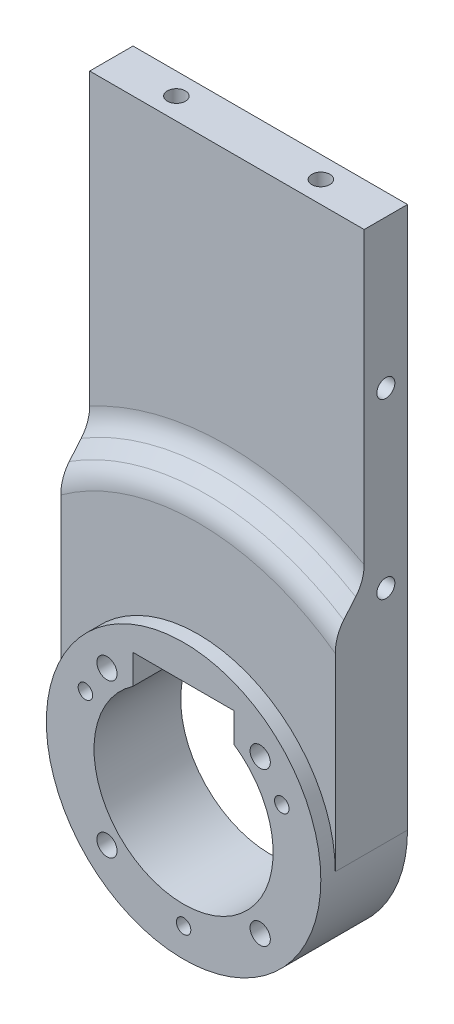
ISO-10303-21;
HEADER;
FILE_DESCRIPTION(('STEP AP214'),'2;1');
FILE_NAME('part.step','',(''),(''),'','','');
FILE_SCHEMA(('AUTOMOTIVE_DESIGN { 1 0 10303 214 1 1 1 1 }'));
ENDSEC;
DATA;
#1=APPLICATION_CONTEXT('core data for automotive mechanical design processes');
#2=APPLICATION_PROTOCOL_DEFINITION('international standard','automotive_design',2000,#1);
#3=PRODUCT_CONTEXT('',#1,'mechanical');
#4=PRODUCT('Part','Part','',(#3));
#5=PRODUCT_RELATED_PRODUCT_CATEGORY('part','',(#4));
#6=PRODUCT_DEFINITION_FORMATION('','',#4);
#7=PRODUCT_DEFINITION_CONTEXT('part definition',#1,'design');
#8=PRODUCT_DEFINITION('design','',#6,#7);
#9=PRODUCT_DEFINITION_SHAPE('','',#8);
#10=(LENGTH_UNIT() NAMED_UNIT(*) SI_UNIT(.MILLI.,.METRE.));
#11=(NAMED_UNIT(*) PLANE_ANGLE_UNIT() SI_UNIT($,.RADIAN.));
#12=(NAMED_UNIT(*) SI_UNIT($,.STERADIAN.) SOLID_ANGLE_UNIT());
#13=UNCERTAINTY_MEASURE_WITH_UNIT(LENGTH_MEASURE(1.E-05),#10,'distance_accuracy_value','');
#14=(GEOMETRIC_REPRESENTATION_CONTEXT(3) GLOBAL_UNCERTAINTY_ASSIGNED_CONTEXT((#13)) GLOBAL_UNIT_ASSIGNED_CONTEXT((#10,
#11,#12)) REPRESENTATION_CONTEXT('',''));
#15=CARTESIAN_POINT('',(0.,0.,0.));
#16=DIRECTION('',(0.,0.,1.));
#17=DIRECTION('',(1.,0.,0.));
#18=AXIS2_PLACEMENT_3D('',#15,#16,#17);
#19=CARTESIAN_POINT('',(0.,0.,6.));
#20=DIRECTION('',(0.,0.,1.));
#21=DIRECTION('',(1.,0.,0.));
#22=AXIS2_PLACEMENT_3D('',#19,#20,#21);
#23=PLANE('',#22);
#24=DIRECTION('',(0.,-1.,0.));
#25=VECTOR('',#24,1.);
#26=CARTESIAN_POINT('',(-19.,75.,6.));
#27=LINE('',#26,#25);
#28=CARTESIAN_POINT('',(-19.,75.,6.));
#29=VERTEX_POINT('',#28);
#30=CARTESIAN_POINT('',(-19.,34.808994368776,6.));
#31=VERTEX_POINT('',#30);
#32=EDGE_CURVE('E215',#29,#31,#27,.T.);
#33=ORIENTED_EDGE('',*,*,#32,.T.);
#34=CARTESIAN_POINT('',(0.,0.,6.));
#35=DIRECTION('',(0.,0.,1.));
#36=DIRECTION('',(1.,0.,0.));
#37=AXIS2_PLACEMENT_3D('',#34,#35,#36);
#38=CIRCLE('',#37,39.6568542494924);
#39=CARTESIAN_POINT('',(19.,34.808994368776,6.));
#40=VERTEX_POINT('',#39);
#41=EDGE_CURVE('E49',#31,#40,#38,.F.);
#42=ORIENTED_EDGE('',*,*,#41,.T.);
#43=DIRECTION('',(0.,1.,0.));
#44=VECTOR('',#43,1.);
#45=CARTESIAN_POINT('',(19.,75.,6.));
#46=LINE('',#45,#44);
#47=CARTESIAN_POINT('',(19.,75.,6.));
#48=VERTEX_POINT('',#47);
#49=EDGE_CURVE('E217',#40,#48,#46,.T.);
#50=ORIENTED_EDGE('',*,*,#49,.T.);
#51=DIRECTION('',(-1.,0.,0.));
#52=VECTOR('',#51,1.);
#53=CARTESIAN_POINT('',(-19.,75.,6.));
#54=LINE('',#53,#52);
#55=EDGE_CURVE('E220',#48,#29,#54,.T.);
#56=ORIENTED_EDGE('',*,*,#55,.T.);
#57=EDGE_LOOP('',(#33,#42,#50,#56));
#58=FACE_BOUND('',#57,.T.);
#59=ADVANCED_FACE('F34',(#58),#23,.T.);
#60=CARTESIAN_POINT('',(0.,0.,12.));
#61=DIRECTION('',(0.,0.,-1.));
#62=DIRECTION('',(-1.,0.,0.));
#63=AXIS2_PLACEMENT_3D('',#60,#61,#62);
#64=CYLINDRICAL_SURFACE('',#63,19.);
#65=CARTESIAN_POINT('',(0.,0.,12.));
#66=DIRECTION('',(0.,0.,1.));
#67=DIRECTION('',(1.,0.,0.));
#68=AXIS2_PLACEMENT_3D('',#65,#66,#67);
#69=CIRCLE('',#68,19.);
#70=CARTESIAN_POINT('',(19.,0.,12.));
#71=VERTEX_POINT('',#70);
#72=EDGE_CURVE('E196',#71,#71,#69,.T.);
#73=ORIENTED_EDGE('',*,*,#72,.F.);
#74=EDGE_LOOP('',(#73));
#75=FACE_BOUND('',#74,.T.);
#76=DIRECTION('',(0.,0.,1.));
#77=VECTOR('',#76,1.);
#78=CARTESIAN_POINT('',(19.,0.,0.));
#79=LINE('',#78,#77);
#80=CARTESIAN_POINT('',(19.,0.,0.));
#81=VERTEX_POINT('',#80);
#82=CARTESIAN_POINT('',(19.,0.,10.));
#83=VERTEX_POINT('',#82);
#84=EDGE_CURVE('E126',#81,#83,#79,.T.);
#85=ORIENTED_EDGE('',*,*,#84,.T.);
#86=CARTESIAN_POINT('',(0.,0.,10.));
#87=DIRECTION('',(0.,0.,-1.));
#88=DIRECTION('',(1.,0.,0.));
#89=AXIS2_PLACEMENT_3D('',#86,#87,#88);
#90=CIRCLE('',#89,19.);
#91=CARTESIAN_POINT('',(-19.,0.,10.));
#92=VERTEX_POINT('',#91);
#93=EDGE_CURVE('E130',#92,#83,#90,.T.);
#94=ORIENTED_EDGE('',*,*,#93,.F.);
#95=DIRECTION('',(0.,0.,1.));
#96=VECTOR('',#95,1.);
#97=CARTESIAN_POINT('',(-19.,0.,0.));
#98=LINE('',#97,#96);
#99=CARTESIAN_POINT('',(-19.,0.,0.));
#100=VERTEX_POINT('',#99);
#101=EDGE_CURVE('E158',#100,#92,#98,.T.);
#102=ORIENTED_EDGE('',*,*,#101,.F.);
#103=CARTESIAN_POINT('',(0.,0.,0.));
#104=DIRECTION('',(0.,0.,-1.));
#105=DIRECTION('',(1.,0.,0.));
#106=AXIS2_PLACEMENT_3D('',#103,#104,#105);
#107=CIRCLE('',#106,19.);
#108=EDGE_CURVE('E132',#81,#100,#107,.T.);
#109=ORIENTED_EDGE('',*,*,#108,.F.);
#110=EDGE_LOOP('',(#85,#94,#102,#109));
#111=FACE_BOUND('',#110,.T.);
#112=ADVANCED_FACE('F128',(#75,#111),#64,.T.);
#113=CARTESIAN_POINT('',(19.,75.,6.));
#114=DIRECTION('',(-1.,0.,0.));
#115=DIRECTION('',(0.,-1.,0.));
#116=AXIS2_PLACEMENT_3D('',#113,#114,#115);
#117=PLANE('',#116);
#118=CARTESIAN_POINT('',(19.,54.5,3.));
#119=DIRECTION('',(1.,0.,0.));
#120=DIRECTION('',(0.,1.,0.));
#121=AXIS2_PLACEMENT_3D('',#118,#119,#120);
#122=CIRCLE('',#121,1.25);
#123=CARTESIAN_POINT('',(19.,55.75,3.));
#124=VERTEX_POINT('',#123);
#125=EDGE_CURVE('E647',#124,#124,#122,.T.);
#126=ORIENTED_EDGE('',*,*,#125,.F.);
#127=EDGE_LOOP('',(#126));
#128=FACE_BOUND('',#127,.T.);
#129=CARTESIAN_POINT('',(19.,30.5,2.99999999999999));
#130=DIRECTION('',(1.,0.,0.));
#131=DIRECTION('',(0.,1.,0.));
#132=AXIS2_PLACEMENT_3D('',#129,#130,#131);
#133=CIRCLE('',#132,1.25);
#134=CARTESIAN_POINT('',(19.,31.75,2.99999999999999));
#135=VERTEX_POINT('',#134);
#136=EDGE_CURVE('E152',#135,#135,#133,.T.);
#137=ORIENTED_EDGE('',*,*,#136,.F.);
#138=EDGE_LOOP('',(#137));
#139=FACE_BOUND('',#138,.T.);
#140=CARTESIAN_POINT('',(19.,32.9089653438087,5.99999999999998));
#141=CARTESIAN_POINT('',(19.,32.5195350657431,6.3372503755815));
#142=CARTESIAN_POINT('',(19.,32.1293693618819,6.67365326912495));
#143=CARTESIAN_POINT('',(19.,31.3474312550015,7.34456372657585));
#144=CARTESIAN_POINT('',(19.,30.9556588978773,7.67907134398188));
#145=CARTESIAN_POINT('',(19.,30.1703477823739,8.34601154822303));
#146=CARTESIAN_POINT('',(19.,29.7768090160158,8.67844412566892));
#147=CARTESIAN_POINT('',(19.,28.9877807491557,9.34100850440187));
#148=CARTESIAN_POINT('',(19.,28.5922911936026,9.67114024011761));
#149=CARTESIAN_POINT('',(19.,28.1957443597434,9.99999999999999));
#150=B_SPLINE_CURVE_WITH_KNOTS('',3,(#140,#141,#142,#143,#144,#145,#146,#147,#148,#149),
.UNSPECIFIED.,.F.,.F.,(4,2,2,2,4),(0.,1.54549184712993,3.09093984962551,4.63639483997989,
6.18189369538237),.UNSPECIFIED.);
#151=CARTESIAN_POINT('',(19.,31.5488992594491,7.17157287525203));
#152=VERTEX_POINT('',#151);
#153=CARTESIAN_POINT('',(19.,29.597965107745,8.82842712474619));
#154=VERTEX_POINT('',#153);
#155=EDGE_CURVE('E246',#152,#154,#150,.T.);
#156=ORIENTED_EDGE('',*,*,#155,.T.);
#157=CARTESIAN_POINT('',(19.,29.597965107745,8.82842712474618));
#158=CARTESIAN_POINT('',(19.,29.4919065328283,8.91768837974446));
#159=CARTESIAN_POINT('',(19.,29.3816576859946,9.00186885032771));
#160=CARTESIAN_POINT('',(19.,29.1541243865014,9.15988783520558));
#161=CARTESIAN_POINT('',(19.,29.036846619476,9.23373596105041));
#162=CARTESIAN_POINT('',(19.,28.7968620515857,9.37081188719202));
#163=CARTESIAN_POINT('',(19.,28.6741779994448,9.43407965343674));
#164=CARTESIAN_POINT('',(19.,28.4240567149396,9.55037898172715));
#165=CARTESIAN_POINT('',(19.,28.2966184798285,9.60340836957331));
#166=CARTESIAN_POINT('',(19.,27.9097391901998,9.7468646671594));
#167=CARTESIAN_POINT('',(19.,27.644613896835,9.82228690794831));
#168=CARTESIAN_POINT('',(19.,27.1064155087954,9.93399809458266));
#169=CARTESIAN_POINT('',(19.,26.8333438004872,9.97029382507096));
#170=CARTESIAN_POINT('',(19.,26.4951564978915,9.99185808802287));
#171=CARTESIAN_POINT('',(19.,26.4309059552187,9.99491817191787));
#172=CARTESIAN_POINT('',(19.,26.3024468733753,9.99898692334438));
#173=CARTESIAN_POINT('',(19.,26.238238442268,9.99999899660098));
#174=CARTESIAN_POINT('',(19.,26.1740153021767,10.));
#175=B_SPLINE_CURVE_WITH_KNOTS('',3,(#157,#158,#159,#160,#161,#162,#163,#164,#165,#166,#167,
#168,#169,#170,#171,#172,#173,#174),.UNSPECIFIED.,.F.,.F.,(4,2,2,2,2,2,2,2,4),(0.,
0.41561326583791,0.830837304255981,1.24445561136543,1.65816165717238,2.48176764171188,
3.30523078775854,3.49818362063744,3.69081531938064),.UNSPECIFIED.);
#176=CARTESIAN_POINT('',(19.,26.1740153021767,10.));
#177=VERTEX_POINT('',#176);
#178=EDGE_CURVE('E141',#154,#177,#175,.T.);
#179=ORIENTED_EDGE('',*,*,#178,.T.);
#180=DIRECTION('',(0.,1.,0.));
#181=VECTOR('',#180,1.);
#182=CARTESIAN_POINT('',(19.,0.,10.));
#183=LINE('',#182,#181);
#184=EDGE_CURVE('E138',#83,#177,#183,.T.);
#185=ORIENTED_EDGE('',*,*,#184,.F.);
#186=ORIENTED_EDGE('',*,*,#84,.F.);
#187=DIRECTION('',(0.,1.,0.));
#188=VECTOR('',#187,1.);
#189=CARTESIAN_POINT('',(19.,75.,0.));
#190=LINE('',#189,#188);
#191=CARTESIAN_POINT('',(19.,75.,0.));
#192=VERTEX_POINT('',#191);
#193=EDGE_CURVE('E225',#81,#192,#190,.T.);
#194=ORIENTED_EDGE('',*,*,#193,.T.);
#195=DIRECTION('',(0.,0.,-1.));
#196=VECTOR('',#195,1.);
#197=CARTESIAN_POINT('',(19.,75.,6.));
#198=LINE('',#197,#196);
#199=EDGE_CURVE('E230',#48,#192,#198,.T.);
#200=ORIENTED_EDGE('',*,*,#199,.F.);
#201=ORIENTED_EDGE('',*,*,#49,.F.);
#202=CARTESIAN_POINT('',(19.,34.808994368776,6.));
#203=CARTESIAN_POINT('',(19.,34.6349302889858,5.99999937494936));
#204=CARTESIAN_POINT('',(19.,34.4608734666004,6.00875452322883));
#205=CARTESIAN_POINT('',(19.,34.1144231811628,6.04358741951495));
#206=CARTESIAN_POINT('',(19.,33.9420304927317,6.06967287395044));
#207=CARTESIAN_POINT('',(19.,33.6066830311186,6.13776533911659));
#208=CARTESIAN_POINT('',(19.,33.4436090306491,6.1791836904789));
#209=CARTESIAN_POINT('',(19.,33.122297367658,6.2777655753672));
#210=CARTESIAN_POINT('',(19.,32.9640606284333,6.33493209418383));
#211=CARTESIAN_POINT('',(19.,32.5839384676425,6.49424552207805));
#212=CARTESIAN_POINT('',(19.,32.3655609467998,6.60504852800766));
#213=CARTESIAN_POINT('',(19.,32.0500303323952,6.79672001004934));
#214=CARTESIAN_POINT('',(19.,31.9456164327236,6.86590196479529));
#215=CARTESIAN_POINT('',(19.,31.7426448506393,7.01255724914577));
#216=CARTESIAN_POINT('',(19.,31.6440925735598,7.09003805271506));
#217=CARTESIAN_POINT('',(19.,31.5488992594497,7.17157287525154));
#218=B_SPLINE_CURVE_WITH_KNOTS('',3,(#202,#203,#204,#205,#206,#207,#208,#209,#210,#211,#212,
#213,#214,#215,#216,#217),.UNSPECIFIED.,.F.,.F.,(4,2,2,2,2,2,2,4),(0.,0.521963830096361,
1.04415992221061,1.54809532844078,2.05212632865654,2.78365329785986,3.15906174793801,
3.53481118080826),.UNSPECIFIED.);
#219=EDGE_CURVE('E294',#40,#152,#218,.T.);
#220=ORIENTED_EDGE('',*,*,#219,.T.);
#221=EDGE_LOOP('',(#156,#179,#185,#186,#194,#200,#201,#220));
#222=FACE_BOUND('',#221,.T.);
#223=ADVANCED_FACE('F139',(#128,#139,#222),#117,.F.);
#224=CARTESIAN_POINT('',(0.,0.,0.));
#225=DIRECTION('',(0.,0.,1.));
#226=DIRECTION('',(1.,0.,0.));
#227=AXIS2_PLACEMENT_3D('',#224,#225,#226);
#228=PLANE('',#227);
#229=CARTESIAN_POINT('',(0.,-15.,0.));
#230=DIRECTION('',(0.,0.,-1.));
#231=DIRECTION('',(-1.,0.,0.));
#232=AXIS2_PLACEMENT_3D('',#229,#230,#231);
#233=CIRCLE('',#232,0.999999999999998);
#234=CARTESIAN_POINT('',(-0.999999999999998,-15.,0.));
#235=VERTEX_POINT('',#234);
#236=EDGE_CURVE('E672',#235,#235,#233,.T.);
#237=ORIENTED_EDGE('',*,*,#236,.F.);
#238=EDGE_LOOP('',(#237));
#239=FACE_BOUND('',#238,.T.);
#240=CARTESIAN_POINT('',(13.5946168055497,6.33927392611055,0.));
#241=DIRECTION('',(0.,0.,-1.));
#242=DIRECTION('',(-1.,0.,0.));
#243=AXIS2_PLACEMENT_3D('',#240,#241,#242);
#244=CIRCLE('',#243,1.);
#245=CARTESIAN_POINT('',(12.5946168055497,6.33927392611055,0.));
#246=VERTEX_POINT('',#245);
#247=EDGE_CURVE('E666',#246,#246,#244,.T.);
#248=ORIENTED_EDGE('',*,*,#247,.F.);
#249=EDGE_LOOP('',(#248));
#250=FACE_BOUND('',#249,.T.);
#251=CARTESIAN_POINT('',(-13.5946168055498,6.33927392611046,0.));
#252=DIRECTION('',(0.,0.,-1.));
#253=DIRECTION('',(-1.,0.,0.));
#254=AXIS2_PLACEMENT_3D('',#251,#252,#253);
#255=CIRCLE('',#254,0.999999999999998);
#256=CARTESIAN_POINT('',(-14.5946168055498,6.33927392611046,0.));
#257=VERTEX_POINT('',#256);
#258=EDGE_CURVE('E660',#257,#257,#255,.T.);
#259=ORIENTED_EDGE('',*,*,#258,.F.);
#260=EDGE_LOOP('',(#259));
#261=FACE_BOUND('',#260,.T.);
#262=CARTESIAN_POINT('',(0.,0.,0.));
#263=DIRECTION('',(0.,0.,1.));
#264=DIRECTION('',(1.,0.,0.));
#265=AXIS2_PLACEMENT_3D('',#262,#263,#264);
#266=CIRCLE('',#265,12.4);
#267=CARTESIAN_POINT('',(-7.,10.2352332655392,0.));
#268=VERTEX_POINT('',#267);
#269=CARTESIAN_POINT('',(7.,10.2352332655392,0.));
#270=VERTEX_POINT('',#269);
#271=EDGE_CURVE('E209',#268,#270,#266,.T.);
#272=ORIENTED_EDGE('',*,*,#271,.T.);
#273=DIRECTION('',(0.,-1.,0.));
#274=VECTOR('',#273,1.);
#275=CARTESIAN_POINT('',(7.,14.3,0.));
#276=LINE('',#275,#274);
#277=CARTESIAN_POINT('',(7.,14.3,0.));
#278=VERTEX_POINT('',#277);
#279=EDGE_CURVE('E199',#278,#270,#276,.T.);
#280=ORIENTED_EDGE('',*,*,#279,.F.);
#281=DIRECTION('',(1.,0.,0.));
#282=VECTOR('',#281,1.);
#283=CARTESIAN_POINT('',(7.,14.3,0.));
#284=LINE('',#283,#282);
#285=CARTESIAN_POINT('',(-7.,14.3,0.));
#286=VERTEX_POINT('',#285);
#287=EDGE_CURVE('E203',#286,#278,#284,.T.);
#288=ORIENTED_EDGE('',*,*,#287,.F.);
#289=DIRECTION('',(0.,1.,0.));
#290=VECTOR('',#289,1.);
#291=CARTESIAN_POINT('',(-7.,14.3,0.));
#292=LINE('',#291,#290);
#293=EDGE_CURVE('E201',#268,#286,#292,.T.);
#294=ORIENTED_EDGE('',*,*,#293,.F.);
#295=EDGE_LOOP('',(#272,#280,#288,#294));
#296=FACE_BOUND('',#295,.T.);
#297=CARTESIAN_POINT('',(10.6066017177982,10.6066017177983,0.));
#298=DIRECTION('',(0.,0.,-1.));
#299=DIRECTION('',(-1.,0.,0.));
#300=AXIS2_PLACEMENT_3D('',#297,#298,#299);
#301=CIRCLE('',#300,2.55);
#302=CARTESIAN_POINT('',(8.05660171779815,10.6066017177983,0.));
#303=VERTEX_POINT('',#302);
#304=EDGE_CURVE('E164',#303,#303,#301,.T.);
#305=ORIENTED_EDGE('',*,*,#304,.F.);
#306=EDGE_LOOP('',(#305));
#307=FACE_BOUND('',#306,.T.);
#308=CARTESIAN_POINT('',(10.6066017177983,-10.6066017177981,0.));
#309=DIRECTION('',(0.,0.,-1.));
#310=DIRECTION('',(-1.,0.,0.));
#311=AXIS2_PLACEMENT_3D('',#308,#309,#310);
#312=CIRCLE('',#311,2.55);
#313=CARTESIAN_POINT('',(8.05660171779827,-10.6066017177981,0.));
#314=VERTEX_POINT('',#313);
#315=EDGE_CURVE('E160',#314,#314,#312,.T.);
#316=ORIENTED_EDGE('',*,*,#315,.F.);
#317=EDGE_LOOP('',(#316));
#318=FACE_BOUND('',#317,.T.);
#319=CARTESIAN_POINT('',(-10.6066017177982,-10.6066017177983,0.));
#320=DIRECTION('',(0.,0.,-1.));
#321=DIRECTION('',(-1.,0.,0.));
#322=AXIS2_PLACEMENT_3D('',#319,#320,#321);
#323=CIRCLE('',#322,2.55);
#324=CARTESIAN_POINT('',(-13.1566017177982,-10.6066017177983,0.));
#325=VERTEX_POINT('',#324);
#326=EDGE_CURVE('E165',#325,#325,#323,.T.);
#327=ORIENTED_EDGE('',*,*,#326,.F.);
#328=EDGE_LOOP('',(#327));
#329=FACE_BOUND('',#328,.T.);
#330=CARTESIAN_POINT('',(-10.6066017177983,10.6066017177981,0.));
#331=DIRECTION('',(0.,0.,-1.));
#332=DIRECTION('',(-1.,0.,0.));
#333=AXIS2_PLACEMENT_3D('',#330,#331,#332);
#334=CIRCLE('',#333,2.55);
#335=CARTESIAN_POINT('',(-13.1566017177983,10.6066017177981,0.));
#336=VERTEX_POINT('',#335);
#337=EDGE_CURVE('E161',#336,#336,#334,.T.);
#338=ORIENTED_EDGE('',*,*,#337,.F.);
#339=EDGE_LOOP('',(#338));
#340=FACE_BOUND('',#339,.T.);
#341=ORIENTED_EDGE('',*,*,#193,.F.);
#342=ORIENTED_EDGE('',*,*,#108,.T.);
#343=DIRECTION('',(0.,-1.,0.));
#344=VECTOR('',#343,1.);
#345=CARTESIAN_POINT('',(-19.,75.,0.));
#346=LINE('',#345,#344);
#347=CARTESIAN_POINT('',(-19.,75.,0.));
#348=VERTEX_POINT('',#347);
#349=EDGE_CURVE('E214',#348,#100,#346,.T.);
#350=ORIENTED_EDGE('',*,*,#349,.F.);
#351=DIRECTION('',(-1.,0.,0.));
#352=VECTOR('',#351,1.);
#353=CARTESIAN_POINT('',(-19.,75.,0.));
#354=LINE('',#353,#352);
#355=EDGE_CURVE('E218',#192,#348,#354,.T.);
#356=ORIENTED_EDGE('',*,*,#355,.F.);
#357=EDGE_LOOP('',(#341,#342,#350,#356));
#358=FACE_BOUND('',#357,.T.);
#359=ADVANCED_FACE('F259',(#239,#250,#261,#296,#307,#318,#329,#340,#358),#228,.F.);
#360=CARTESIAN_POINT('',(-19.,75.,6.));
#361=DIRECTION('',(1.,0.,0.));
#362=DIRECTION('',(0.,1.,0.));
#363=AXIS2_PLACEMENT_3D('',#360,#361,#362);
#364=PLANE('',#363);
#365=CARTESIAN_POINT('',(-19.,54.5,3.));
#366=DIRECTION('',(1.,0.,0.));
#367=DIRECTION('',(0.,1.,0.));
#368=AXIS2_PLACEMENT_3D('',#365,#366,#367);
#369=CIRCLE('',#368,1.25);
#370=CARTESIAN_POINT('',(-19.,55.75,3.));
#371=VERTEX_POINT('',#370);
#372=EDGE_CURVE('E644',#371,#371,#369,.T.);
#373=ORIENTED_EDGE('',*,*,#372,.T.);
#374=EDGE_LOOP('',(#373));
#375=FACE_BOUND('',#374,.T.);
#376=CARTESIAN_POINT('',(-19.,30.5,2.99999999999999));
#377=DIRECTION('',(1.,0.,0.));
#378=DIRECTION('',(0.,1.,0.));
#379=AXIS2_PLACEMENT_3D('',#376,#377,#378);
#380=CIRCLE('',#379,1.25);
#381=CARTESIAN_POINT('',(-19.,31.75,2.99999999999999));
#382=VERTEX_POINT('',#381);
#383=EDGE_CURVE('E149',#382,#382,#380,.T.);
#384=ORIENTED_EDGE('',*,*,#383,.T.);
#385=EDGE_LOOP('',(#384));
#386=FACE_BOUND('',#385,.T.);
#387=DIRECTION('',(0.,-1.,0.));
#388=VECTOR('',#387,1.);
#389=CARTESIAN_POINT('',(-19.,0.,10.));
#390=LINE('',#389,#388);
#391=CARTESIAN_POINT('',(-19.,26.1740153021767,10.));
#392=VERTEX_POINT('',#391);
#393=EDGE_CURVE('E135',#392,#92,#390,.T.);
#394=ORIENTED_EDGE('',*,*,#393,.F.);
#395=CARTESIAN_POINT('',(-19.,26.1740153021767,10.));
#396=CARTESIAN_POINT('',(-19.,26.5193384394121,10.0000319959534));
#397=CARTESIAN_POINT('',(-19.,26.8655741157984,9.97066966897817));
#398=CARTESIAN_POINT('',(-19.,27.5359646955387,9.85249236040688));
#399=CARTESIAN_POINT('',(-19.,27.8604715136549,9.76564044881714));
#400=CARTESIAN_POINT('',(-19.,28.4284984820853,9.55408547331916));
#401=CARTESIAN_POINT('',(-19.,28.6757597473848,9.43959385170264));
#402=CARTESIAN_POINT('',(-19.,29.0327373385782,9.23627738383561));
#403=CARTESIAN_POINT('',(-19.,29.1508835701965,9.16203328407398));
#404=CARTESIAN_POINT('',(-19.,29.3800815186219,9.00306667983025));
#405=CARTESIAN_POINT('',(-19.,29.4911253904097,8.91833288191122));
#406=CARTESIAN_POINT('',(-19.,29.5979651077448,8.82842712474639));
#407=B_SPLINE_CURVE_WITH_KNOTS('',3,(#395,#396,#397,#398,#399,#400,#401,#402,#403,#404,#405,
#406),.UNSPECIFIED.,.F.,.F.,(4,2,2,2,2,4),(0.,1.03615407453542,2.03863576283167,
2.85228520248584,3.27038380396229,3.68893651938604),.UNSPECIFIED.);
#408=CARTESIAN_POINT('',(-19.,29.5979651077448,8.82842712474634));
#409=VERTEX_POINT('',#408);
#410=EDGE_CURVE('E267',#392,#409,#407,.T.);
#411=ORIENTED_EDGE('',*,*,#410,.T.);
#412=CARTESIAN_POINT('',(-19.,28.1957443597434,10.));
#413=CARTESIAN_POINT('',(-19.,28.5922911936026,9.67114024011761));
#414=CARTESIAN_POINT('',(-19.,28.9877807491557,9.34100850440187));
#415=CARTESIAN_POINT('',(-19.,29.7768090160158,8.67844412566892));
#416=CARTESIAN_POINT('',(-19.,30.1703477823739,8.34601154822303));
#417=CARTESIAN_POINT('',(-19.,30.9556588978773,7.67907134398188));
#418=CARTESIAN_POINT('',(-19.,31.3474312550015,7.34456372657585));
#419=CARTESIAN_POINT('',(-19.,32.1293693618819,6.67365326912495));
#420=CARTESIAN_POINT('',(-19.,32.5195350657431,6.33725037558151));
#421=CARTESIAN_POINT('',(-19.,32.9089653438087,5.99999999999999));
#422=B_SPLINE_CURVE_WITH_KNOTS('',3,(#412,#413,#414,#415,#416,#417,#418,#419,#420,#421),
.UNSPECIFIED.,.F.,.F.,(4,2,2,2,4),(0.,1.54549885540249,3.09095384575686,4.63640184825244,
6.18189369538237),.UNSPECIFIED.);
#423=CARTESIAN_POINT('',(-19.,31.5488992594485,7.17157287525259));
#424=VERTEX_POINT('',#423);
#425=EDGE_CURVE('E238',#409,#424,#422,.T.);
#426=ORIENTED_EDGE('',*,*,#425,.T.);
#427=CARTESIAN_POINT('',(-18.9999999999959,31.5488992594496,7.17157287525382));
#428=CARTESIAN_POINT('',(-18.9999999999985,31.7563914616386,6.99386174338914));
#429=CARTESIAN_POINT('',(-18.9999999999996,31.9797028346662,6.8355186312678));
#430=CARTESIAN_POINT('',(-19.0000000000004,32.4498229987833,6.55888484776382));
#431=CARTESIAN_POINT('',(-19.0000000000001,32.6966191543027,6.44057279274977));
#432=CARTESIAN_POINT('',(-18.9999999999999,33.2052651007616,6.24533277682103));
#433=CARTESIAN_POINT('',(-19.,33.4670817234058,6.16831724425026));
#434=CARTESIAN_POINT('',(-19.,33.9991650191899,6.05616455140743));
#435=CARTESIAN_POINT('',(-19.,34.2694154699631,6.02095153363642));
#436=CARTESIAN_POINT('',(-19.,34.6299526492349,6.00231158171195));
#437=CARTESIAN_POINT('',(-19.,34.7194927993564,5.99999492240646));
#438=CARTESIAN_POINT('',(-19.,34.808994368776,6.));
#439=B_SPLINE_CURVE_WITH_KNOTS('',3,(#427,#428,#429,#430,#431,#432,#433,#434,#435,#436,#437,
#438),.UNSPECIFIED.,.F.,.F.,(4,2,2,2,2,4),(0.,0.817631498281702,1.6348255453153,
2.45027976251873,3.26425193161029,3.53283216482318),.UNSPECIFIED.);
#440=EDGE_CURVE('E289',#424,#31,#439,.T.);
#441=ORIENTED_EDGE('',*,*,#440,.T.);
#442=ORIENTED_EDGE('',*,*,#32,.F.);
#443=DIRECTION('',(0.,0.,-1.));
#444=VECTOR('',#443,1.);
#445=CARTESIAN_POINT('',(-19.,75.,6.));
#446=LINE('',#445,#444);
#447=EDGE_CURVE('E222',#29,#348,#446,.T.);
#448=ORIENTED_EDGE('',*,*,#447,.T.);
#449=ORIENTED_EDGE('',*,*,#349,.T.);
#450=ORIENTED_EDGE('',*,*,#101,.T.);
#451=EDGE_LOOP('',(#394,#411,#426,#441,#442,#448,#449,#450));
#452=FACE_BOUND('',#451,.T.);
#453=ADVANCED_FACE('F255',(#375,#386,#452),#364,.F.);
#454=CARTESIAN_POINT('',(-10.6066017177982,-10.6066017177983,0.));
#455=DIRECTION('',(0.,0.,1.));
#456=DIRECTION('',(1.,0.,0.));
#457=AXIS2_PLACEMENT_3D('',#454,#455,#456);
#458=CYLINDRICAL_SURFACE('',#457,1.4);
#459=CARTESIAN_POINT('',(-10.6066017177982,-10.6066017177983,8.50000000000001));
#460=DIRECTION('',(0.,0.,-1.));
#461=DIRECTION('',(-1.,0.,0.));
#462=AXIS2_PLACEMENT_3D('',#459,#460,#461);
#463=CIRCLE('',#462,1.4);
#464=CARTESIAN_POINT('',(-12.0066017177982,-10.6066017177983,8.50000000000001));
#465=VERTEX_POINT('',#464);
#466=EDGE_CURVE('E302',#465,#465,#463,.T.);
#467=ORIENTED_EDGE('',*,*,#466,.T.);
#468=EDGE_LOOP('',(#467));
#469=FACE_BOUND('',#468,.T.);
#470=CARTESIAN_POINT('',(-10.6066017177982,-10.6066017177983,12.));
#471=DIRECTION('',(0.,0.,1.));
#472=DIRECTION('',(1.,0.,0.));
#473=AXIS2_PLACEMENT_3D('',#470,#471,#472);
#474=CIRCLE('',#473,1.4);
#475=CARTESIAN_POINT('',(-9.20660171779815,-10.6066017177983,12.));
#476=VERTEX_POINT('',#475);
#477=EDGE_CURVE('E172',#476,#476,#474,.T.);
#478=ORIENTED_EDGE('',*,*,#477,.T.);
#479=EDGE_LOOP('',(#478));
#480=FACE_BOUND('',#479,.T.);
#481=ADVANCED_FACE('F258',(#469,#480),#458,.F.);
#482=CARTESIAN_POINT('',(10.6066017177983,-10.6066017177981,0.));
#483=DIRECTION('',(0.,0.,1.));
#484=DIRECTION('',(1.,0.,0.));
#485=AXIS2_PLACEMENT_3D('',#482,#483,#484);
#486=CYLINDRICAL_SURFACE('',#485,1.4);
#487=CARTESIAN_POINT('',(10.6066017177983,-10.6066017177981,8.50000000000001));
#488=DIRECTION('',(0.,0.,-1.));
#489=DIRECTION('',(-1.,0.,0.));
#490=AXIS2_PLACEMENT_3D('',#487,#488,#489);
#491=CIRCLE('',#490,1.4);
#492=CARTESIAN_POINT('',(9.20660171779828,-10.6066017177981,8.50000000000001));
#493=VERTEX_POINT('',#492);
#494=EDGE_CURVE('E299',#493,#493,#491,.T.);
#495=ORIENTED_EDGE('',*,*,#494,.T.);
#496=EDGE_LOOP('',(#495));
#497=FACE_BOUND('',#496,.T.);
#498=CARTESIAN_POINT('',(10.6066017177983,-10.6066017177981,12.));
#499=DIRECTION('',(0.,0.,1.));
#500=DIRECTION('',(1.,0.,0.));
#501=AXIS2_PLACEMENT_3D('',#498,#499,#500);
#502=CIRCLE('',#501,1.4);
#503=CARTESIAN_POINT('',(12.0066017177983,-10.6066017177981,12.));
#504=VERTEX_POINT('',#503);
#505=EDGE_CURVE('E177',#504,#504,#502,.T.);
#506=ORIENTED_EDGE('',*,*,#505,.T.);
#507=EDGE_LOOP('',(#506));
#508=FACE_BOUND('',#507,.T.);
#509=ADVANCED_FACE('F410',(#497,#508),#486,.F.);
#510=CARTESIAN_POINT('',(-10.6066017177983,10.6066017177981,0.));
#511=DIRECTION('',(0.,0.,1.));
#512=DIRECTION('',(1.,0.,0.));
#513=AXIS2_PLACEMENT_3D('',#510,#511,#512);
#514=CYLINDRICAL_SURFACE('',#513,1.4);
#515=CARTESIAN_POINT('',(-10.6066017177983,10.6066017177981,8.50000000000001));
#516=DIRECTION('',(0.,0.,-1.));
#517=DIRECTION('',(-1.,0.,0.));
#518=AXIS2_PLACEMENT_3D('',#515,#516,#517);
#519=CIRCLE('',#518,1.4);
#520=CARTESIAN_POINT('',(-12.0066017177983,10.6066017177981,8.50000000000001));
#521=VERTEX_POINT('',#520);
#522=EDGE_CURVE('E305',#521,#521,#519,.T.);
#523=ORIENTED_EDGE('',*,*,#522,.T.);
#524=EDGE_LOOP('',(#523));
#525=FACE_BOUND('',#524,.T.);
#526=CARTESIAN_POINT('',(-10.6066017177983,10.6066017177981,12.));
#527=DIRECTION('',(0.,0.,1.));
#528=DIRECTION('',(1.,0.,0.));
#529=AXIS2_PLACEMENT_3D('',#526,#527,#528);
#530=CIRCLE('',#529,1.4);
#531=CARTESIAN_POINT('',(-9.20660171779827,10.6066017177981,12.));
#532=VERTEX_POINT('',#531);
#533=EDGE_CURVE('E173',#532,#532,#530,.T.);
#534=ORIENTED_EDGE('',*,*,#533,.T.);
#535=EDGE_LOOP('',(#534));
#536=FACE_BOUND('',#535,.T.);
#537=ADVANCED_FACE('F359',(#525,#536),#514,.F.);
#538=CARTESIAN_POINT('',(10.6066017177982,10.6066017177983,0.));
#539=DIRECTION('',(0.,0.,1.));
#540=DIRECTION('',(1.,0.,0.));
#541=AXIS2_PLACEMENT_3D('',#538,#539,#540);
#542=CYLINDRICAL_SURFACE('',#541,1.4);
#543=CARTESIAN_POINT('',(10.6066017177982,10.6066017177983,8.50000000000001));
#544=DIRECTION('',(0.,0.,-1.));
#545=DIRECTION('',(-1.,0.,0.));
#546=AXIS2_PLACEMENT_3D('',#543,#544,#545);
#547=CIRCLE('',#546,1.4);
#548=CARTESIAN_POINT('',(9.20660171779815,10.6066017177983,8.50000000000001));
#549=VERTEX_POINT('',#548);
#550=EDGE_CURVE('E308',#549,#549,#547,.T.);
#551=ORIENTED_EDGE('',*,*,#550,.T.);
#552=EDGE_LOOP('',(#551));
#553=FACE_BOUND('',#552,.T.);
#554=CARTESIAN_POINT('',(10.6066017177982,10.6066017177983,12.));
#555=DIRECTION('',(0.,0.,1.));
#556=DIRECTION('',(1.,0.,0.));
#557=AXIS2_PLACEMENT_3D('',#554,#555,#556);
#558=CIRCLE('',#557,1.4);
#559=CARTESIAN_POINT('',(12.0066017177981,10.6066017177983,12.));
#560=VERTEX_POINT('',#559);
#561=EDGE_CURVE('E176',#560,#560,#558,.T.);
#562=ORIENTED_EDGE('',*,*,#561,.T.);
#563=EDGE_LOOP('',(#562));
#564=FACE_BOUND('',#563,.T.);
#565=ADVANCED_FACE('F351',(#553,#564),#542,.F.);
#566=CARTESIAN_POINT('',(-19.,75.,6.));
#567=DIRECTION('',(0.,-1.,0.));
#568=DIRECTION('',(0.,0.,-1.));
#569=AXIS2_PLACEMENT_3D('',#566,#567,#568);
#570=PLANE('',#569);
#571=CARTESIAN_POINT('',(10.,75.,3.));
#572=DIRECTION('',(0.,1.,0.));
#573=DIRECTION('',(0.,0.,1.));
#574=AXIS2_PLACEMENT_3D('',#571,#572,#573);
#575=CIRCLE('',#574,1.25);
#576=CARTESIAN_POINT('',(10.,75.,4.25));
#577=VERTEX_POINT('',#576);
#578=EDGE_CURVE('E365',#577,#577,#575,.T.);
#579=ORIENTED_EDGE('',*,*,#578,.F.);
#580=EDGE_LOOP('',(#579));
#581=FACE_BOUND('',#580,.T.);
#582=CARTESIAN_POINT('',(-10.,75.,3.));
#583=DIRECTION('',(0.,1.,0.));
#584=DIRECTION('',(0.,0.,1.));
#585=AXIS2_PLACEMENT_3D('',#582,#583,#584);
#586=CIRCLE('',#585,1.25);
#587=CARTESIAN_POINT('',(-10.,75.,4.25));
#588=VERTEX_POINT('',#587);
#589=EDGE_CURVE('E369',#588,#588,#586,.T.);
#590=ORIENTED_EDGE('',*,*,#589,.F.);
#591=EDGE_LOOP('',(#590));
#592=FACE_BOUND('',#591,.T.);
#593=ORIENTED_EDGE('',*,*,#355,.T.);
#594=ORIENTED_EDGE('',*,*,#447,.F.);
#595=ORIENTED_EDGE('',*,*,#55,.F.);
#596=ORIENTED_EDGE('',*,*,#199,.T.);
#597=EDGE_LOOP('',(#593,#594,#595,#596));
#598=FACE_BOUND('',#597,.T.);
#599=ADVANCED_FACE('F349',(#581,#592,#598),#570,.F.);
#600=CARTESIAN_POINT('',(0.,0.,0.));
#601=DIRECTION('',(0.,0.,1.));
#602=DIRECTION('',(1.,0.,0.));
#603=AXIS2_PLACEMENT_3D('',#600,#601,#602);
#604=CYLINDRICAL_SURFACE('',#603,12.4);
#605=DIRECTION('',(0.,0.,1.));
#606=VECTOR('',#605,1.);
#607=CARTESIAN_POINT('',(-7.,10.2352332655392,0.));
#608=LINE('',#607,#606);
#609=CARTESIAN_POINT('',(-7.,10.2352332655392,12.));
#610=VERTEX_POINT('',#609);
#611=EDGE_CURVE('E233',#268,#610,#608,.T.);
#612=ORIENTED_EDGE('',*,*,#611,.T.);
#613=CARTESIAN_POINT('',(0.,0.,12.));
#614=DIRECTION('',(0.,0.,1.));
#615=DIRECTION('',(1.,0.,0.));
#616=AXIS2_PLACEMENT_3D('',#613,#614,#615);
#617=CIRCLE('',#616,12.4);
#618=CARTESIAN_POINT('',(7.,10.2352332655392,12.));
#619=VERTEX_POINT('',#618);
#620=EDGE_CURVE('E190',#610,#619,#617,.T.);
#621=ORIENTED_EDGE('',*,*,#620,.T.);
#622=DIRECTION('',(0.,0.,1.));
#623=VECTOR('',#622,1.);
#624=CARTESIAN_POINT('',(7.,10.2352332655392,0.));
#625=LINE('',#624,#623);
#626=EDGE_CURVE('E235',#619,#270,#625,.F.);
#627=ORIENTED_EDGE('',*,*,#626,.T.);
#628=ORIENTED_EDGE('',*,*,#271,.F.);
#629=EDGE_LOOP('',(#612,#621,#627,#628));
#630=FACE_BOUND('',#629,.T.);
#631=ADVANCED_FACE('F345',(#630),#604,.F.);
#632=CARTESIAN_POINT('',(7.,14.3,6.));
#633=DIRECTION('',(1.,0.,0.));
#634=DIRECTION('',(0.,1.,0.));
#635=AXIS2_PLACEMENT_3D('',#632,#633,#634);
#636=PLANE('',#635);
#637=ORIENTED_EDGE('',*,*,#626,.F.);
#638=DIRECTION('',(0.,1.,0.));
#639=VECTOR('',#638,1.);
#640=CARTESIAN_POINT('',(7.,14.3,12.));
#641=LINE('',#640,#639);
#642=CARTESIAN_POINT('',(7.,14.3,12.));
#643=VERTEX_POINT('',#642);
#644=EDGE_CURVE('E193',#619,#643,#641,.T.);
#645=ORIENTED_EDGE('',*,*,#644,.T.);
#646=DIRECTION('',(0.,0.,-1.));
#647=VECTOR('',#646,1.);
#648=CARTESIAN_POINT('',(7.,14.3,6.));
#649=LINE('',#648,#647);
#650=EDGE_CURVE('E207',#643,#278,#649,.T.);
#651=ORIENTED_EDGE('',*,*,#650,.T.);
#652=ORIENTED_EDGE('',*,*,#279,.T.);
#653=EDGE_LOOP('',(#637,#645,#651,#652));
#654=FACE_BOUND('',#653,.T.);
#655=ADVANCED_FACE('F357',(#654),#636,.F.);
#656=CARTESIAN_POINT('',(-7.,14.3,6.));
#657=DIRECTION('',(-1.,0.,0.));
#658=DIRECTION('',(0.,-1.,0.));
#659=AXIS2_PLACEMENT_3D('',#656,#657,#658);
#660=PLANE('',#659);
#661=ORIENTED_EDGE('',*,*,#293,.T.);
#662=DIRECTION('',(0.,0.,-1.));
#663=VECTOR('',#662,1.);
#664=CARTESIAN_POINT('',(-7.,14.3,6.));
#665=LINE('',#664,#663);
#666=CARTESIAN_POINT('',(-7.,14.3,12.));
#667=VERTEX_POINT('',#666);
#668=EDGE_CURVE('E206',#667,#286,#665,.T.);
#669=ORIENTED_EDGE('',*,*,#668,.F.);
#670=DIRECTION('',(0.,-1.,0.));
#671=VECTOR('',#670,1.);
#672=CARTESIAN_POINT('',(-7.,14.3,12.));
#673=LINE('',#672,#671);
#674=EDGE_CURVE('E187',#667,#610,#673,.T.);
#675=ORIENTED_EDGE('',*,*,#674,.T.);
#676=ORIENTED_EDGE('',*,*,#611,.F.);
#677=EDGE_LOOP('',(#661,#669,#675,#676));
#678=FACE_BOUND('',#677,.T.);
#679=ADVANCED_FACE('F424',(#678),#660,.F.);
#680=CARTESIAN_POINT('',(7.,14.3,6.));
#681=DIRECTION('',(0.,1.,0.));
#682=DIRECTION('',(0.,0.,1.));
#683=AXIS2_PLACEMENT_3D('',#680,#681,#682);
#684=PLANE('',#683);
#685=ORIENTED_EDGE('',*,*,#287,.T.);
#686=ORIENTED_EDGE('',*,*,#650,.F.);
#687=DIRECTION('',(-1.,0.,0.));
#688=VECTOR('',#687,1.);
#689=CARTESIAN_POINT('',(-7.,14.3,12.));
#690=LINE('',#689,#688);
#691=EDGE_CURVE('E184',#643,#667,#690,.T.);
#692=ORIENTED_EDGE('',*,*,#691,.T.);
#693=ORIENTED_EDGE('',*,*,#668,.T.);
#694=EDGE_LOOP('',(#685,#686,#692,#693));
#695=FACE_BOUND('',#694,.T.);
#696=ADVANCED_FACE('F419',(#695),#684,.F.);
#697=CARTESIAN_POINT('',(0.,0.,12.));
#698=DIRECTION('',(0.,0.,1.));
#699=DIRECTION('',(1.,0.,0.));
#700=AXIS2_PLACEMENT_3D('',#697,#698,#699);
#701=PLANE('',#700);
#702=CARTESIAN_POINT('',(0.,-15.,12.));
#703=DIRECTION('',(0.,0.,-1.));
#704=DIRECTION('',(-1.,0.,0.));
#705=AXIS2_PLACEMENT_3D('',#702,#703,#704);
#706=CIRCLE('',#705,0.999999999999998);
#707=CARTESIAN_POINT('',(-0.999999999999998,-15.,12.));
#708=VERTEX_POINT('',#707);
#709=EDGE_CURVE('E663',#708,#708,#706,.T.);
#710=ORIENTED_EDGE('',*,*,#709,.T.);
#711=EDGE_LOOP('',(#710));
#712=FACE_BOUND('',#711,.T.);
#713=CARTESIAN_POINT('',(13.5946168055497,6.33927392611055,12.));
#714=DIRECTION('',(0.,0.,-1.));
#715=DIRECTION('',(-1.,0.,0.));
#716=AXIS2_PLACEMENT_3D('',#713,#714,#715);
#717=CIRCLE('',#716,1.);
#718=CARTESIAN_POINT('',(12.5946168055497,6.33927392611055,12.));
#719=VERTEX_POINT('',#718);
#720=EDGE_CURVE('E669',#719,#719,#717,.T.);
#721=ORIENTED_EDGE('',*,*,#720,.T.);
#722=EDGE_LOOP('',(#721));
#723=FACE_BOUND('',#722,.T.);
#724=CARTESIAN_POINT('',(-13.5946168055498,6.33927392611046,12.));
#725=DIRECTION('',(0.,0.,-1.));
#726=DIRECTION('',(-1.,0.,0.));
#727=AXIS2_PLACEMENT_3D('',#724,#725,#726);
#728=CIRCLE('',#727,0.999999999999998);
#729=CARTESIAN_POINT('',(-14.5946168055498,6.33927392611046,12.));
#730=VERTEX_POINT('',#729);
#731=EDGE_CURVE('E658',#730,#730,#728,.T.);
#732=ORIENTED_EDGE('',*,*,#731,.T.);
#733=EDGE_LOOP('',(#732));
#734=FACE_BOUND('',#733,.T.);
#735=ORIENTED_EDGE('',*,*,#533,.F.);
#736=EDGE_LOOP('',(#735));
#737=FACE_BOUND('',#736,.T.);
#738=ORIENTED_EDGE('',*,*,#505,.F.);
#739=EDGE_LOOP('',(#738));
#740=FACE_BOUND('',#739,.T.);
#741=ORIENTED_EDGE('',*,*,#477,.F.);
#742=EDGE_LOOP('',(#741));
#743=FACE_BOUND('',#742,.T.);
#744=ORIENTED_EDGE('',*,*,#561,.F.);
#745=EDGE_LOOP('',(#744));
#746=FACE_BOUND('',#745,.T.);
#747=ORIENTED_EDGE('',*,*,#72,.T.);
#748=EDGE_LOOP('',(#747));
#749=FACE_BOUND('',#748,.T.);
#750=ORIENTED_EDGE('',*,*,#674,.F.);
#751=ORIENTED_EDGE('',*,*,#691,.F.);
#752=ORIENTED_EDGE('',*,*,#644,.F.);
#753=ORIENTED_EDGE('',*,*,#620,.F.);
#754=EDGE_LOOP('',(#750,#751,#752,#753));
#755=FACE_BOUND('',#754,.T.);
#756=ADVANCED_FACE('F406',(#712,#723,#734,#737,#740,#743,#746,#749,#755),#701,.T.);
#757=CARTESIAN_POINT('',(10.6066017177982,10.6066017177983,7.));
#758=DIRECTION('',(0.,0.,-1.));
#759=DIRECTION('',(-1.,0.,0.));
#760=AXIS2_PLACEMENT_3D('',#757,#758,#759);
#761=CYLINDRICAL_SURFACE('',#760,2.55);
#762=CARTESIAN_POINT('',(10.6066017177982,10.6066017177983,7.35000000000002));
#763=DIRECTION('',(0.,0.,-1.));
#764=DIRECTION('',(-1.,0.,0.));
#765=AXIS2_PLACEMENT_3D('',#762,#763,#764);
#766=CIRCLE('',#765,2.55);
#767=CARTESIAN_POINT('',(8.05660171779815,10.6066017177983,7.35000000000002));
#768=VERTEX_POINT('',#767);
#769=EDGE_CURVE('E11',#768,#768,#766,.F.);
#770=ORIENTED_EDGE('',*,*,#769,.T.);
#771=EDGE_LOOP('',(#770));
#772=FACE_BOUND('',#771,.T.);
#773=ORIENTED_EDGE('',*,*,#304,.T.);
#774=EDGE_LOOP('',(#773));
#775=FACE_BOUND('',#774,.T.);
#776=ADVANCED_FACE('F399',(#772,#775),#761,.F.);
#777=CARTESIAN_POINT('',(-10.6066017177983,10.6066017177981,7.));
#778=DIRECTION('',(0.,0.,-1.));
#779=DIRECTION('',(-1.,0.,0.));
#780=AXIS2_PLACEMENT_3D('',#777,#778,#779);
#781=CYLINDRICAL_SURFACE('',#780,2.55);
#782=CARTESIAN_POINT('',(-10.6066017177983,10.6066017177981,7.35000000000002));
#783=DIRECTION('',(0.,0.,-1.));
#784=DIRECTION('',(-1.,0.,0.));
#785=AXIS2_PLACEMENT_3D('',#782,#783,#784);
#786=CIRCLE('',#785,2.55);
#787=CARTESIAN_POINT('',(-13.1566017177983,10.6066017177981,7.35000000000002));
#788=VERTEX_POINT('',#787);
#789=EDGE_CURVE('E42',#788,#788,#786,.F.);
#790=ORIENTED_EDGE('',*,*,#789,.T.);
#791=EDGE_LOOP('',(#790));
#792=FACE_BOUND('',#791,.T.);
#793=ORIENTED_EDGE('',*,*,#337,.T.);
#794=EDGE_LOOP('',(#793));
#795=FACE_BOUND('',#794,.T.);
#796=ADVANCED_FACE('F319',(#792,#795),#781,.F.);
#797=CARTESIAN_POINT('',(10.6066017177983,-10.6066017177981,7.));
#798=DIRECTION('',(0.,0.,-1.));
#799=DIRECTION('',(-1.,0.,0.));
#800=AXIS2_PLACEMENT_3D('',#797,#798,#799);
#801=CYLINDRICAL_SURFACE('',#800,2.55);
#802=CARTESIAN_POINT('',(10.6066017177983,-10.6066017177981,7.35000000000002));
#803=DIRECTION('',(0.,0.,-1.));
#804=DIRECTION('',(-1.,0.,0.));
#805=AXIS2_PLACEMENT_3D('',#802,#803,#804);
#806=CIRCLE('',#805,2.55);
#807=CARTESIAN_POINT('',(8.05660171779827,-10.6066017177981,7.35000000000002));
#808=VERTEX_POINT('',#807);
#809=EDGE_CURVE('E311',#808,#808,#806,.F.);
#810=ORIENTED_EDGE('',*,*,#809,.T.);
#811=EDGE_LOOP('',(#810));
#812=FACE_BOUND('',#811,.T.);
#813=ORIENTED_EDGE('',*,*,#315,.T.);
#814=EDGE_LOOP('',(#813));
#815=FACE_BOUND('',#814,.T.);
#816=ADVANCED_FACE('F391',(#812,#815),#801,.F.);
#817=CARTESIAN_POINT('',(-10.6066017177982,-10.6066017177983,7.));
#818=DIRECTION('',(0.,0.,-1.));
#819=DIRECTION('',(-1.,0.,0.));
#820=AXIS2_PLACEMENT_3D('',#817,#818,#819);
#821=CYLINDRICAL_SURFACE('',#820,2.55);
#822=CARTESIAN_POINT('',(-10.6066017177982,-10.6066017177983,7.35000000000002));
#823=DIRECTION('',(0.,0.,-1.));
#824=DIRECTION('',(-1.,0.,0.));
#825=AXIS2_PLACEMENT_3D('',#822,#823,#824);
#826=CIRCLE('',#825,2.55);
#827=CARTESIAN_POINT('',(-13.1566017177982,-10.6066017177983,7.35000000000002));
#828=VERTEX_POINT('',#827);
#829=EDGE_CURVE('E314',#828,#828,#826,.F.);
#830=ORIENTED_EDGE('',*,*,#829,.T.);
#831=EDGE_LOOP('',(#830));
#832=FACE_BOUND('',#831,.T.);
#833=ORIENTED_EDGE('',*,*,#326,.T.);
#834=EDGE_LOOP('',(#833));
#835=FACE_BOUND('',#834,.T.);
#836=ADVANCED_FACE('F386',(#832,#835),#821,.F.);
#837=CARTESIAN_POINT('',(0.,0.,10.));
#838=DIRECTION('',(0.,0.,1.));
#839=DIRECTION('',(1.,0.,0.));
#840=AXIS2_PLACEMENT_3D('',#837,#838,#839);
#841=PLANE('',#840);
#842=ORIENTED_EDGE('',*,*,#184,.T.);
#843=CARTESIAN_POINT('',(0.,0.,10.));
#844=DIRECTION('',(0.,0.,1.));
#845=DIRECTION('',(1.,0.,0.));
#846=AXIS2_PLACEMENT_3D('',#843,#844,#845);
#847=CIRCLE('',#846,32.3431457505076);
#848=EDGE_CURVE('E273',#177,#392,#847,.T.);
#849=ORIENTED_EDGE('',*,*,#848,.T.);
#850=ORIENTED_EDGE('',*,*,#393,.T.);
#851=ORIENTED_EDGE('',*,*,#93,.T.);
#852=EDGE_LOOP('',(#842,#849,#850,#851));
#853=FACE_BOUND('',#852,.T.);
#854=ADVANCED_FACE('F146',(#853),#841,.T.);
#855=CARTESIAN_POINT('',(0.,0.,10.));
#856=DIRECTION('',(0.,0.,-1.));
#857=DIRECTION('',(-1.,0.,0.));
#858=AXIS2_PLACEMENT_3D('',#855,#856,#857);
#859=CONICAL_SURFACE('',#858,34.,0.785398163397446);
#860=ORIENTED_EDGE('',*,*,#425,.F.);
#861=CARTESIAN_POINT('',(0.,0.,8.82842712474618));
#862=DIRECTION('',(0.,0.,1.));
#863=DIRECTION('',(1.,0.,0.));
#864=AXIS2_PLACEMENT_3D('',#861,#862,#863);
#865=CIRCLE('',#864,35.1715728752538);
#866=EDGE_CURVE('E57',#409,#154,#865,.F.);
#867=ORIENTED_EDGE('',*,*,#866,.T.);
#868=ORIENTED_EDGE('',*,*,#155,.F.);
#869=CARTESIAN_POINT('',(0.,0.,7.17157287525382));
#870=DIRECTION('',(0.,0.,-1.));
#871=DIRECTION('',(-1.,0.,0.));
#872=AXIS2_PLACEMENT_3D('',#869,#870,#871);
#873=CIRCLE('',#872,36.8284271247462);
#874=EDGE_CURVE('E272',#152,#424,#873,.F.);
#875=ORIENTED_EDGE('',*,*,#874,.T.);
#876=EDGE_LOOP('',(#860,#867,#868,#875));
#877=FACE_BOUND('',#876,.T.);
#878=ADVANCED_FACE('F252',(#877),#859,.T.);
#879=CARTESIAN_POINT('',(0.,0.,6.));
#880=DIRECTION('',(0.,0.,1.));
#881=DIRECTION('',(1.,0.,0.));
#882=AXIS2_PLACEMENT_3D('',#879,#880,#881);
#883=TOROIDAL_SURFACE('',#882,32.3431457505076,4.);
#884=ORIENTED_EDGE('',*,*,#178,.F.);
#885=ORIENTED_EDGE('',*,*,#866,.F.);
#886=ORIENTED_EDGE('',*,*,#410,.F.);
#887=ORIENTED_EDGE('',*,*,#848,.F.);
#888=EDGE_LOOP('',(#884,#885,#886,#887));
#889=FACE_BOUND('',#888,.T.);
#890=ADVANCED_FACE('F275',(#889),#883,.T.);
#891=CARTESIAN_POINT('',(0.,0.,10.));
#892=DIRECTION('',(0.,0.,1.));
#893=DIRECTION('',(1.,0.,0.));
#894=AXIS2_PLACEMENT_3D('',#891,#892,#893);
#895=TOROIDAL_SURFACE('',#894,39.6568542494924,4.);
#896=ORIENTED_EDGE('',*,*,#219,.F.);
#897=ORIENTED_EDGE('',*,*,#41,.F.);
#898=ORIENTED_EDGE('',*,*,#440,.F.);
#899=ORIENTED_EDGE('',*,*,#874,.F.);
#900=EDGE_LOOP('',(#896,#897,#898,#899));
#901=FACE_BOUND('',#900,.T.);
#902=ADVANCED_FACE('F279',(#901),#895,.F.);
#903=CARTESIAN_POINT('',(-19.,30.5,2.99999999999999));
#904=DIRECTION('',(1.,0.,0.));
#905=DIRECTION('',(0.,1.,0.));
#906=AXIS2_PLACEMENT_3D('',#903,#904,#905);
#907=CYLINDRICAL_SURFACE('',#906,1.25);
#908=ORIENTED_EDGE('',*,*,#383,.F.);
#909=EDGE_LOOP('',(#908));
#910=FACE_BOUND('',#909,.T.);
#911=ORIENTED_EDGE('',*,*,#136,.T.);
#912=EDGE_LOOP('',(#911));
#913=FACE_BOUND('',#912,.T.);
#914=ADVANCED_FACE('F396',(#910,#913),#907,.F.);
#915=CARTESIAN_POINT('',(-19.,54.5,3.));
#916=DIRECTION('',(1.,0.,0.));
#917=DIRECTION('',(0.,1.,0.));
#918=AXIS2_PLACEMENT_3D('',#915,#916,#917);
#919=CYLINDRICAL_SURFACE('',#918,1.25);
#920=ORIENTED_EDGE('',*,*,#372,.F.);
#921=EDGE_LOOP('',(#920));
#922=FACE_BOUND('',#921,.T.);
#923=ORIENTED_EDGE('',*,*,#125,.T.);
#924=EDGE_LOOP('',(#923));
#925=FACE_BOUND('',#924,.T.);
#926=ADVANCED_FACE('F595',(#922,#925),#919,.F.);
#927=CARTESIAN_POINT('',(-10.,65.,3.));
#928=DIRECTION('',(0.,1.,0.));
#929=DIRECTION('',(0.,0.,1.));
#930=AXIS2_PLACEMENT_3D('',#927,#928,#929);
#931=CYLINDRICAL_SURFACE('',#930,1.25);
#932=CARTESIAN_POINT('',(-10.,65.,3.));
#933=DIRECTION('',(0.,1.,0.));
#934=DIRECTION('',(0.,0.,1.));
#935=AXIS2_PLACEMENT_3D('',#932,#933,#934);
#936=CIRCLE('',#935,1.25);
#937=CARTESIAN_POINT('',(-10.,65.,4.25));
#938=VERTEX_POINT('',#937);
#939=EDGE_CURVE('E649',#938,#938,#936,.T.);
#940=ORIENTED_EDGE('',*,*,#939,.F.);
#941=EDGE_LOOP('',(#940));
#942=FACE_BOUND('',#941,.T.);
#943=ORIENTED_EDGE('',*,*,#589,.T.);
#944=EDGE_LOOP('',(#943));
#945=FACE_BOUND('',#944,.T.);
#946=ADVANCED_FACE('F599',(#942,#945),#931,.F.);
#947=CARTESIAN_POINT('',(-10.,65.,3.));
#948=DIRECTION('',(0.,1.,0.));
#949=DIRECTION('',(0.,0.,1.));
#950=AXIS2_PLACEMENT_3D('',#947,#948,#949);
#951=PLANE('',#950);
#952=ORIENTED_EDGE('',*,*,#939,.T.);
#953=EDGE_LOOP('',(#952));
#954=FACE_BOUND('',#953,.T.);
#955=ADVANCED_FACE('F604',(#954),#951,.T.);
#956=CARTESIAN_POINT('',(10.,65.,3.));
#957=DIRECTION('',(0.,1.,0.));
#958=DIRECTION('',(0.,0.,1.));
#959=AXIS2_PLACEMENT_3D('',#956,#957,#958);
#960=CYLINDRICAL_SURFACE('',#959,1.25);
#961=CARTESIAN_POINT('',(10.,65.,3.));
#962=DIRECTION('',(0.,1.,0.));
#963=DIRECTION('',(0.,0.,1.));
#964=AXIS2_PLACEMENT_3D('',#961,#962,#963);
#965=CIRCLE('',#964,1.25);
#966=CARTESIAN_POINT('',(10.,65.,4.25));
#967=VERTEX_POINT('',#966);
#968=EDGE_CURVE('E655',#967,#967,#965,.T.);
#969=ORIENTED_EDGE('',*,*,#968,.F.);
#970=EDGE_LOOP('',(#969));
#971=FACE_BOUND('',#970,.T.);
#972=ORIENTED_EDGE('',*,*,#578,.T.);
#973=EDGE_LOOP('',(#972));
#974=FACE_BOUND('',#973,.T.);
#975=ADVANCED_FACE('F614',(#971,#974),#960,.F.);
#976=CARTESIAN_POINT('',(10.,65.,3.));
#977=DIRECTION('',(0.,1.,0.));
#978=DIRECTION('',(0.,0.,1.));
#979=AXIS2_PLACEMENT_3D('',#976,#977,#978);
#980=PLANE('',#979);
#981=ORIENTED_EDGE('',*,*,#968,.T.);
#982=EDGE_LOOP('',(#981));
#983=FACE_BOUND('',#982,.T.);
#984=ADVANCED_FACE('F497',(#983),#980,.T.);
#985=CARTESIAN_POINT('',(10.6066017177983,-10.6066017177981,7.));
#986=DIRECTION('',(0.,0.,-1.));
#987=DIRECTION('',(-1.,0.,0.));
#988=AXIS2_PLACEMENT_3D('',#985,#986,#987);
#989=CONICAL_SURFACE('',#988,2.90000000000002,0.785398163397453);
#990=ORIENTED_EDGE('',*,*,#494,.F.);
#991=EDGE_LOOP('',(#990));
#992=FACE_BOUND('',#991,.T.);
#993=ORIENTED_EDGE('',*,*,#809,.F.);
#994=EDGE_LOOP('',(#993));
#995=FACE_BOUND('',#994,.T.);
#996=ADVANCED_FACE('F332',(#992,#995),#989,.F.);
#997=CARTESIAN_POINT('',(-10.6066017177982,-10.6066017177983,7.));
#998=DIRECTION('',(0.,0.,-1.));
#999=DIRECTION('',(-1.,0.,0.));
#1000=AXIS2_PLACEMENT_3D('',#997,#998,#999);
#1001=CONICAL_SURFACE('',#1000,2.90000000000003,0.785398163397453);
#1002=ORIENTED_EDGE('',*,*,#466,.F.);
#1003=EDGE_LOOP('',(#1002));
#1004=FACE_BOUND('',#1003,.T.);
#1005=ORIENTED_EDGE('',*,*,#829,.F.);
#1006=EDGE_LOOP('',(#1005));
#1007=FACE_BOUND('',#1006,.T.);
#1008=ADVANCED_FACE('F324',(#1004,#1007),#1001,.F.);
#1009=CARTESIAN_POINT('',(-10.6066017177983,10.6066017177981,7.));
#1010=DIRECTION('',(0.,0.,-1.));
#1011=DIRECTION('',(-1.,0.,0.));
#1012=AXIS2_PLACEMENT_3D('',#1009,#1010,#1011);
#1013=CONICAL_SURFACE('',#1012,2.90000000000003,0.785398163397454);
#1014=ORIENTED_EDGE('',*,*,#522,.F.);
#1015=EDGE_LOOP('',(#1014));
#1016=FACE_BOUND('',#1015,.T.);
#1017=ORIENTED_EDGE('',*,*,#789,.F.);
#1018=EDGE_LOOP('',(#1017));
#1019=FACE_BOUND('',#1018,.T.);
#1020=ADVANCED_FACE('F322',(#1016,#1019),#1013,.F.);
#1021=CARTESIAN_POINT('',(10.6066017177982,10.6066017177983,7.));
#1022=DIRECTION('',(0.,0.,-1.));
#1023=DIRECTION('',(-1.,0.,0.));
#1024=AXIS2_PLACEMENT_3D('',#1021,#1022,#1023);
#1025=CONICAL_SURFACE('',#1024,2.90000000000002,0.785398163397453);
#1026=ORIENTED_EDGE('',*,*,#550,.F.);
#1027=EDGE_LOOP('',(#1026));
#1028=FACE_BOUND('',#1027,.T.);
#1029=ORIENTED_EDGE('',*,*,#769,.F.);
#1030=EDGE_LOOP('',(#1029));
#1031=FACE_BOUND('',#1030,.T.);
#1032=ADVANCED_FACE('F36',(#1028,#1031),#1025,.F.);
#1033=CARTESIAN_POINT('',(-13.5946168055498,6.33927392611046,12.));
#1034=DIRECTION('',(0.,0.,-1.));
#1035=DIRECTION('',(-1.,0.,0.));
#1036=AXIS2_PLACEMENT_3D('',#1033,#1034,#1035);
#1037=CYLINDRICAL_SURFACE('',#1036,0.999999999999998);
#1038=ORIENTED_EDGE('',*,*,#731,.F.);
#1039=EDGE_LOOP('',(#1038));
#1040=FACE_BOUND('',#1039,.T.);
#1041=ORIENTED_EDGE('',*,*,#258,.T.);
#1042=EDGE_LOOP('',(#1041));
#1043=FACE_BOUND('',#1042,.T.);
#1044=ADVANCED_FACE('F330',(#1040,#1043),#1037,.F.);
#1045=CARTESIAN_POINT('',(13.5946168055497,6.33927392611055,12.));
#1046=DIRECTION('',(0.,0.,-1.));
#1047=DIRECTION('',(-1.,0.,0.));
#1048=AXIS2_PLACEMENT_3D('',#1045,#1046,#1047);
#1049=CYLINDRICAL_SURFACE('',#1048,1.);
#1050=ORIENTED_EDGE('',*,*,#720,.F.);
#1051=EDGE_LOOP('',(#1050));
#1052=FACE_BOUND('',#1051,.T.);
#1053=ORIENTED_EDGE('',*,*,#247,.T.);
#1054=EDGE_LOOP('',(#1053));
#1055=FACE_BOUND('',#1054,.T.);
#1056=ADVANCED_FACE('F682',(#1052,#1055),#1049,.F.);
#1057=CARTESIAN_POINT('',(0.,-15.,12.));
#1058=DIRECTION('',(0.,0.,-1.));
#1059=DIRECTION('',(-1.,0.,0.));
#1060=AXIS2_PLACEMENT_3D('',#1057,#1058,#1059);
#1061=CYLINDRICAL_SURFACE('',#1060,0.999999999999998);
#1062=ORIENTED_EDGE('',*,*,#709,.F.);
#1063=EDGE_LOOP('',(#1062));
#1064=FACE_BOUND('',#1063,.T.);
#1065=ORIENTED_EDGE('',*,*,#236,.T.);
#1066=EDGE_LOOP('',(#1065));
#1067=FACE_BOUND('',#1066,.T.);
#1068=ADVANCED_FACE('F679',(#1064,#1067),#1061,.F.);
#1069=CLOSED_SHELL('',(#59,#112,#223,#359,#453,#481,#509,#537,#565,#599,#631,#655,#679,#696,
#756,#776,#796,#816,#836,#854,#878,#890,#902,#914,#926,#946,#955,#975,#984,#996,#1008,#1020,
#1032,#1044,#1056,#1068));
#1070=MANIFOLD_SOLID_BREP('B2',#1069);
#1071=ADVANCED_BREP_SHAPE_REPRESENTATION('',(#18,#1070),#14);
#1072=SHAPE_DEFINITION_REPRESENTATION(#9,#1071);
ENDSEC;
END-ISO-10303-21;
